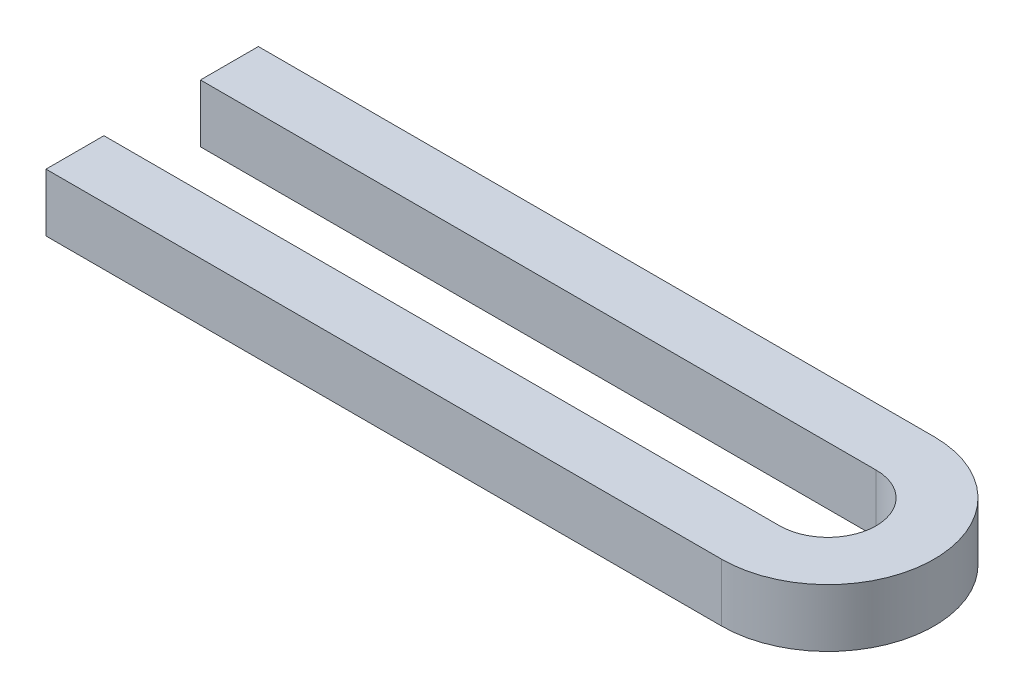
ISO-10303-21;
HEADER;
FILE_DESCRIPTION(('STEP AP214'),'2;1');
FILE_NAME('part.step','',(''),(''),'','','');
FILE_SCHEMA(('AUTOMOTIVE_DESIGN { 1 0 10303 214 1 1 1 1 }'));
ENDSEC;
DATA;
#1=APPLICATION_CONTEXT('core data for automotive mechanical design processes');
#2=APPLICATION_PROTOCOL_DEFINITION('international standard','automotive_design',2000,#1);
#3=PRODUCT_CONTEXT('',#1,'mechanical');
#4=PRODUCT('Part','Part','',(#3));
#5=PRODUCT_RELATED_PRODUCT_CATEGORY('part','',(#4));
#6=PRODUCT_DEFINITION_FORMATION('','',#4);
#7=PRODUCT_DEFINITION_CONTEXT('part definition',#1,'design');
#8=PRODUCT_DEFINITION('design','',#6,#7);
#9=PRODUCT_DEFINITION_SHAPE('','',#8);
#10=(LENGTH_UNIT() NAMED_UNIT(*) SI_UNIT(.MILLI.,.METRE.));
#11=(NAMED_UNIT(*) PLANE_ANGLE_UNIT() SI_UNIT($,.RADIAN.));
#12=(NAMED_UNIT(*) SI_UNIT($,.STERADIAN.) SOLID_ANGLE_UNIT());
#13=UNCERTAINTY_MEASURE_WITH_UNIT(LENGTH_MEASURE(1.E-05),#10,'distance_accuracy_value','');
#14=(GEOMETRIC_REPRESENTATION_CONTEXT(3) GLOBAL_UNCERTAINTY_ASSIGNED_CONTEXT((#13)) GLOBAL_UNIT_ASSIGNED_CONTEXT((#10,
#11,#12)) REPRESENTATION_CONTEXT('',''));
#15=CARTESIAN_POINT('',(0.,0.,0.));
#16=DIRECTION('',(0.,0.,1.));
#17=DIRECTION('',(1.,0.,0.));
#18=AXIS2_PLACEMENT_3D('',#15,#16,#17);
#19=CARTESIAN_POINT('',(0.,3.,0.));
#20=DIRECTION('',(0.,-1.,0.));
#21=DIRECTION('',(0.,0.,-1.));
#22=AXIS2_PLACEMENT_3D('',#19,#20,#21);
#23=CYLINDRICAL_SURFACE('',#22,2.5);
#24=CARTESIAN_POINT('',(0.,0.,0.));
#25=DIRECTION('',(0.,-1.,0.));
#26=DIRECTION('',(0.,0.,-1.));
#27=AXIS2_PLACEMENT_3D('',#24,#25,#26);
#28=CIRCLE('',#27,2.5);
#29=CARTESIAN_POINT('',(0.,0.,-2.5));
#30=VERTEX_POINT('',#29);
#31=CARTESIAN_POINT('',(0.,0.,2.5));
#32=VERTEX_POINT('',#31);
#33=EDGE_CURVE('E144',#30,#32,#28,.T.);
#34=ORIENTED_EDGE('',*,*,#33,.T.);
#35=DIRECTION('',(0.,-1.,0.));
#36=VECTOR('',#35,1.);
#37=CARTESIAN_POINT('',(0.,3.,2.5));
#38=LINE('',#37,#36);
#39=CARTESIAN_POINT('',(0.,3.,2.5));
#40=VERTEX_POINT('',#39);
#41=EDGE_CURVE('E11',#40,#32,#38,.T.);
#42=ORIENTED_EDGE('',*,*,#41,.F.);
#43=CARTESIAN_POINT('',(0.,3.,0.));
#44=DIRECTION('',(0.,-1.,0.));
#45=DIRECTION('',(0.,0.,-1.));
#46=AXIS2_PLACEMENT_3D('',#43,#44,#45);
#47=CIRCLE('',#46,2.5);
#48=CARTESIAN_POINT('',(0.,3.,-2.5));
#49=VERTEX_POINT('',#48);
#50=EDGE_CURVE('E166',#49,#40,#47,.T.);
#51=ORIENTED_EDGE('',*,*,#50,.F.);
#52=DIRECTION('',(0.,-1.,0.));
#53=VECTOR('',#52,1.);
#54=CARTESIAN_POINT('',(0.,3.,-2.5));
#55=LINE('',#54,#53);
#56=EDGE_CURVE('E140',#49,#30,#55,.T.);
#57=ORIENTED_EDGE('',*,*,#56,.T.);
#58=EDGE_LOOP('',(#34,#42,#51,#57));
#59=FACE_BOUND('',#58,.T.);
#60=ADVANCED_FACE('F43',(#59),#23,.F.);
#61=CARTESIAN_POINT('',(0.,3.,2.5));
#62=DIRECTION('',(0.,0.,1.));
#63=DIRECTION('',(1.,0.,0.));
#64=AXIS2_PLACEMENT_3D('',#61,#62,#63);
#65=PLANE('',#64);
#66=DIRECTION('',(-1.,0.,0.));
#67=VECTOR('',#66,1.);
#68=CARTESIAN_POINT('',(0.,0.,2.5));
#69=LINE('',#68,#67);
#70=CARTESIAN_POINT('',(-35.,0.,2.5));
#71=VERTEX_POINT('',#70);
#72=EDGE_CURVE('E148',#32,#71,#69,.T.);
#73=ORIENTED_EDGE('',*,*,#72,.T.);
#74=DIRECTION('',(0.,-1.,0.));
#75=VECTOR('',#74,1.);
#76=CARTESIAN_POINT('',(-35.,3.,2.5));
#77=LINE('',#76,#75);
#78=CARTESIAN_POINT('',(-35.,3.,2.5));
#79=VERTEX_POINT('',#78);
#80=EDGE_CURVE('E52',#79,#71,#77,.T.);
#81=ORIENTED_EDGE('',*,*,#80,.F.);
#82=DIRECTION('',(-1.,0.,0.));
#83=VECTOR('',#82,1.);
#84=CARTESIAN_POINT('',(0.,3.,2.5));
#85=LINE('',#84,#83);
#86=EDGE_CURVE('E103',#40,#79,#85,.T.);
#87=ORIENTED_EDGE('',*,*,#86,.F.);
#88=ORIENTED_EDGE('',*,*,#41,.T.);
#89=EDGE_LOOP('',(#73,#81,#87,#88));
#90=FACE_BOUND('',#89,.T.);
#91=ADVANCED_FACE('F212',(#90),#65,.F.);
#92=CARTESIAN_POINT('',(-35.,3.,2.5));
#93=DIRECTION('',(1.,0.,0.));
#94=DIRECTION('',(0.,0.,-1.));
#95=AXIS2_PLACEMENT_3D('',#92,#93,#94);
#96=PLANE('',#95);
#97=DIRECTION('',(0.,0.,1.));
#98=VECTOR('',#97,1.);
#99=CARTESIAN_POINT('',(-35.,0.,2.5));
#100=LINE('',#99,#98);
#101=CARTESIAN_POINT('',(-35.,0.,5.50000000000001));
#102=VERTEX_POINT('',#101);
#103=EDGE_CURVE('E151',#71,#102,#100,.T.);
#104=ORIENTED_EDGE('',*,*,#103,.T.);
#105=DIRECTION('',(0.,-1.,0.));
#106=VECTOR('',#105,1.);
#107=CARTESIAN_POINT('',(-35.,3.,5.50000000000001));
#108=LINE('',#107,#106);
#109=CARTESIAN_POINT('',(-35.,3.,5.50000000000001));
#110=VERTEX_POINT('',#109);
#111=EDGE_CURVE('E177',#110,#102,#108,.T.);
#112=ORIENTED_EDGE('',*,*,#111,.F.);
#113=DIRECTION('',(0.,0.,1.));
#114=VECTOR('',#113,1.);
#115=CARTESIAN_POINT('',(-35.,3.,2.5));
#116=LINE('',#115,#114);
#117=EDGE_CURVE('E187',#79,#110,#116,.T.);
#118=ORIENTED_EDGE('',*,*,#117,.F.);
#119=ORIENTED_EDGE('',*,*,#80,.T.);
#120=EDGE_LOOP('',(#104,#112,#118,#119));
#121=FACE_BOUND('',#120,.T.);
#122=ADVANCED_FACE('F185',(#121),#96,.F.);
#123=CARTESIAN_POINT('',(0.,3.,5.5));
#124=DIRECTION('',(0.,0.,-1.));
#125=DIRECTION('',(-1.,0.,0.));
#126=AXIS2_PLACEMENT_3D('',#123,#124,#125);
#127=PLANE('',#126);
#128=DIRECTION('',(1.,0.,0.));
#129=VECTOR('',#128,1.);
#130=CARTESIAN_POINT('',(0.,0.,5.5));
#131=LINE('',#130,#129);
#132=CARTESIAN_POINT('',(0.,0.,5.5));
#133=VERTEX_POINT('',#132);
#134=EDGE_CURVE('E154',#102,#133,#131,.T.);
#135=ORIENTED_EDGE('',*,*,#134,.T.);
#136=DIRECTION('',(0.,-1.,0.));
#137=VECTOR('',#136,1.);
#138=CARTESIAN_POINT('',(0.,3.,5.5));
#139=LINE('',#138,#137);
#140=CARTESIAN_POINT('',(0.,3.,5.5));
#141=VERTEX_POINT('',#140);
#142=EDGE_CURVE('E173',#141,#133,#139,.T.);
#143=ORIENTED_EDGE('',*,*,#142,.F.);
#144=DIRECTION('',(1.,0.,0.));
#145=VECTOR('',#144,1.);
#146=CARTESIAN_POINT('',(0.,3.,5.5));
#147=LINE('',#146,#145);
#148=EDGE_CURVE('E200',#110,#141,#147,.T.);
#149=ORIENTED_EDGE('',*,*,#148,.F.);
#150=ORIENTED_EDGE('',*,*,#111,.T.);
#151=EDGE_LOOP('',(#135,#143,#149,#150));
#152=FACE_BOUND('',#151,.T.);
#153=ADVANCED_FACE('F195',(#152),#127,.F.);
#154=CARTESIAN_POINT('',(0.,3.,0.));
#155=DIRECTION('',(0.,-1.,0.));
#156=DIRECTION('',(0.,0.,-1.));
#157=AXIS2_PLACEMENT_3D('',#154,#155,#156);
#158=CYLINDRICAL_SURFACE('',#157,5.5);
#159=CARTESIAN_POINT('',(0.,0.,0.));
#160=DIRECTION('',(0.,1.,0.));
#161=DIRECTION('',(0.,0.,-1.));
#162=AXIS2_PLACEMENT_3D('',#159,#160,#161);
#163=CIRCLE('',#162,5.5);
#164=CARTESIAN_POINT('',(0.,0.,-5.5));
#165=VERTEX_POINT('',#164);
#166=EDGE_CURVE('E157',#133,#165,#163,.T.);
#167=ORIENTED_EDGE('',*,*,#166,.T.);
#168=DIRECTION('',(0.,-1.,0.));
#169=VECTOR('',#168,1.);
#170=CARTESIAN_POINT('',(0.,3.,-5.5));
#171=LINE('',#170,#169);
#172=CARTESIAN_POINT('',(0.,3.,-5.5));
#173=VERTEX_POINT('',#172);
#174=EDGE_CURVE('E133',#173,#165,#171,.T.);
#175=ORIENTED_EDGE('',*,*,#174,.F.);
#176=CARTESIAN_POINT('',(0.,3.,0.));
#177=DIRECTION('',(0.,1.,0.));
#178=DIRECTION('',(0.,0.,-1.));
#179=AXIS2_PLACEMENT_3D('',#176,#177,#178);
#180=CIRCLE('',#179,5.5);
#181=EDGE_CURVE('E122',#141,#173,#180,.T.);
#182=ORIENTED_EDGE('',*,*,#181,.F.);
#183=ORIENTED_EDGE('',*,*,#142,.T.);
#184=EDGE_LOOP('',(#167,#175,#182,#183));
#185=FACE_BOUND('',#184,.T.);
#186=ADVANCED_FACE('F198',(#185),#158,.T.);
#187=CARTESIAN_POINT('',(0.,3.,-5.5));
#188=DIRECTION('',(0.,0.,1.));
#189=DIRECTION('',(1.,0.,0.));
#190=AXIS2_PLACEMENT_3D('',#187,#188,#189);
#191=PLANE('',#190);
#192=DIRECTION('',(-1.,0.,0.));
#193=VECTOR('',#192,1.);
#194=CARTESIAN_POINT('',(0.,0.,-5.5));
#195=LINE('',#194,#193);
#196=CARTESIAN_POINT('',(-35.,0.,-5.5));
#197=VERTEX_POINT('',#196);
#198=EDGE_CURVE('E131',#165,#197,#195,.T.);
#199=ORIENTED_EDGE('',*,*,#198,.T.);
#200=DIRECTION('',(0.,-1.,0.));
#201=VECTOR('',#200,1.);
#202=CARTESIAN_POINT('',(-35.,3.,-5.5));
#203=LINE('',#202,#201);
#204=CARTESIAN_POINT('',(-35.,3.,-5.5));
#205=VERTEX_POINT('',#204);
#206=EDGE_CURVE('E128',#205,#197,#203,.T.);
#207=ORIENTED_EDGE('',*,*,#206,.F.);
#208=DIRECTION('',(-1.,0.,0.));
#209=VECTOR('',#208,1.);
#210=CARTESIAN_POINT('',(0.,3.,-5.5));
#211=LINE('',#210,#209);
#212=EDGE_CURVE('E116',#173,#205,#211,.T.);
#213=ORIENTED_EDGE('',*,*,#212,.F.);
#214=ORIENTED_EDGE('',*,*,#174,.T.);
#215=EDGE_LOOP('',(#199,#207,#213,#214));
#216=FACE_BOUND('',#215,.T.);
#217=ADVANCED_FACE('F129',(#216),#191,.F.);
#218=CARTESIAN_POINT('',(-35.,3.,-5.5));
#219=DIRECTION('',(1.,0.,0.));
#220=DIRECTION('',(0.,0.,-1.));
#221=AXIS2_PLACEMENT_3D('',#218,#219,#220);
#222=PLANE('',#221);
#223=DIRECTION('',(0.,0.,1.));
#224=VECTOR('',#223,1.);
#225=CARTESIAN_POINT('',(-35.,0.,-5.5));
#226=LINE('',#225,#224);
#227=CARTESIAN_POINT('',(-35.,0.,-2.5));
#228=VERTEX_POINT('',#227);
#229=EDGE_CURVE('E89',#197,#228,#226,.T.);
#230=ORIENTED_EDGE('',*,*,#229,.T.);
#231=DIRECTION('',(0.,-1.,0.));
#232=VECTOR('',#231,1.);
#233=CARTESIAN_POINT('',(-35.,3.,-2.5));
#234=LINE('',#233,#232);
#235=CARTESIAN_POINT('',(-35.,3.,-2.5));
#236=VERTEX_POINT('',#235);
#237=EDGE_CURVE('E134',#236,#228,#234,.T.);
#238=ORIENTED_EDGE('',*,*,#237,.F.);
#239=DIRECTION('',(0.,0.,1.));
#240=VECTOR('',#239,1.);
#241=CARTESIAN_POINT('',(-35.,3.,-5.5));
#242=LINE('',#241,#240);
#243=EDGE_CURVE('E120',#205,#236,#242,.T.);
#244=ORIENTED_EDGE('',*,*,#243,.F.);
#245=ORIENTED_EDGE('',*,*,#206,.T.);
#246=EDGE_LOOP('',(#230,#238,#244,#245));
#247=FACE_BOUND('',#246,.T.);
#248=ADVANCED_FACE('F136',(#247),#222,.F.);
#249=CARTESIAN_POINT('',(0.,3.,-2.5));
#250=DIRECTION('',(0.,0.,-1.));
#251=DIRECTION('',(-1.,0.,0.));
#252=AXIS2_PLACEMENT_3D('',#249,#250,#251);
#253=PLANE('',#252);
#254=DIRECTION('',(1.,0.,0.));
#255=VECTOR('',#254,1.);
#256=CARTESIAN_POINT('',(0.,0.,-2.5));
#257=LINE('',#256,#255);
#258=EDGE_CURVE('E95',#228,#30,#257,.T.);
#259=ORIENTED_EDGE('',*,*,#258,.T.);
#260=ORIENTED_EDGE('',*,*,#56,.F.);
#261=DIRECTION('',(1.,0.,0.));
#262=VECTOR('',#261,1.);
#263=CARTESIAN_POINT('',(0.,3.,-2.5));
#264=LINE('',#263,#262);
#265=EDGE_CURVE('E60',#236,#49,#264,.T.);
#266=ORIENTED_EDGE('',*,*,#265,.F.);
#267=ORIENTED_EDGE('',*,*,#237,.T.);
#268=EDGE_LOOP('',(#259,#260,#266,#267));
#269=FACE_BOUND('',#268,.T.);
#270=ADVANCED_FACE('F228',(#269),#253,.F.);
#271=CARTESIAN_POINT('',(0.,3.,0.));
#272=DIRECTION('',(0.,-1.,0.));
#273=DIRECTION('',(0.,0.,-1.));
#274=AXIS2_PLACEMENT_3D('',#271,#272,#273);
#275=PLANE('',#274);
#276=ORIENTED_EDGE('',*,*,#50,.T.);
#277=ORIENTED_EDGE('',*,*,#86,.T.);
#278=ORIENTED_EDGE('',*,*,#117,.T.);
#279=ORIENTED_EDGE('',*,*,#148,.T.);
#280=ORIENTED_EDGE('',*,*,#181,.T.);
#281=ORIENTED_EDGE('',*,*,#212,.T.);
#282=ORIENTED_EDGE('',*,*,#243,.T.);
#283=ORIENTED_EDGE('',*,*,#265,.T.);
#284=EDGE_LOOP('',(#276,#277,#278,#279,#280,#281,#282,#283));
#285=FACE_BOUND('',#284,.T.);
#286=ADVANCED_FACE('F118',(#285),#275,.F.);
#287=CARTESIAN_POINT('',(0.,0.,0.));
#288=DIRECTION('',(0.,-1.,0.));
#289=DIRECTION('',(0.,0.,-1.));
#290=AXIS2_PLACEMENT_3D('',#287,#288,#289);
#291=PLANE('',#290);
#292=ORIENTED_EDGE('',*,*,#33,.F.);
#293=ORIENTED_EDGE('',*,*,#258,.F.);
#294=ORIENTED_EDGE('',*,*,#229,.F.);
#295=ORIENTED_EDGE('',*,*,#198,.F.);
#296=ORIENTED_EDGE('',*,*,#166,.F.);
#297=ORIENTED_EDGE('',*,*,#134,.F.);
#298=ORIENTED_EDGE('',*,*,#103,.F.);
#299=ORIENTED_EDGE('',*,*,#72,.F.);
#300=EDGE_LOOP('',(#292,#293,#294,#295,#296,#297,#298,#299));
#301=FACE_BOUND('',#300,.T.);
#302=ADVANCED_FACE('F191',(#301),#291,.T.);
#303=CLOSED_SHELL('',(#60,#91,#122,#153,#186,#217,#248,#270,#286,#302));
#304=MANIFOLD_SOLID_BREP('B2',#303);
#305=ADVANCED_BREP_SHAPE_REPRESENTATION('',(#18,#304),#14);
#306=SHAPE_DEFINITION_REPRESENTATION(#9,#305);
ENDSEC;
END-ISO-10303-21;
